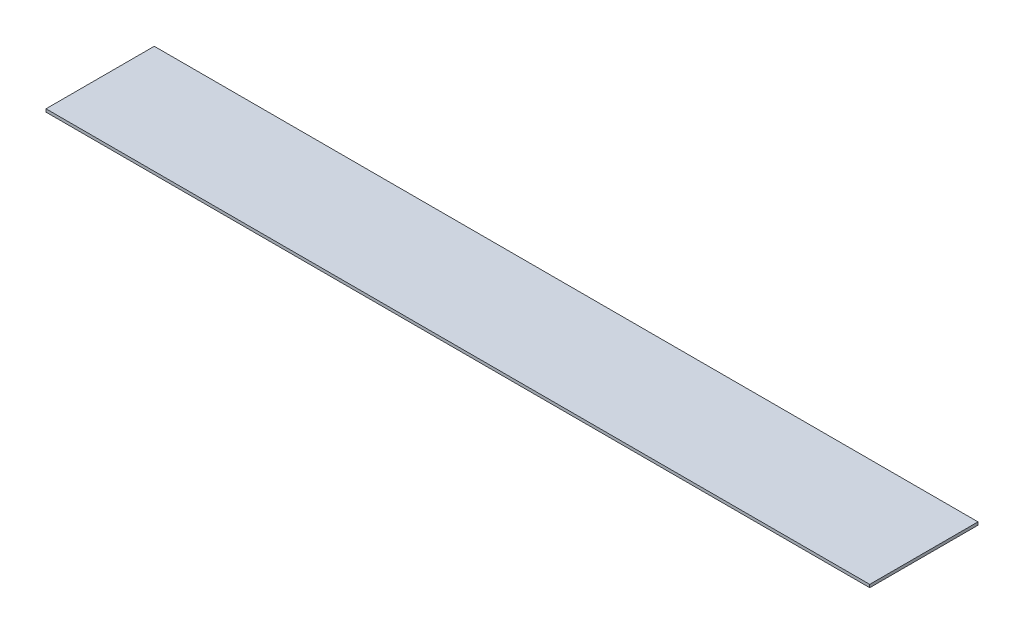
ISO-10303-21;
HEADER;
FILE_DESCRIPTION(('STEP AP214'),'2;1');
FILE_NAME('part.step','',(''),(''),'','','');
FILE_SCHEMA(('AUTOMOTIVE_DESIGN { 1 0 10303 214 1 1 1 1 }'));
ENDSEC;
DATA;
#1=APPLICATION_CONTEXT('core data for automotive mechanical design processes');
#2=APPLICATION_PROTOCOL_DEFINITION('international standard','automotive_design',2000,#1);
#3=PRODUCT_CONTEXT('',#1,'mechanical');
#4=PRODUCT('Part','Part','',(#3));
#5=PRODUCT_RELATED_PRODUCT_CATEGORY('part','',(#4));
#6=PRODUCT_DEFINITION_FORMATION('','',#4);
#7=PRODUCT_DEFINITION_CONTEXT('part definition',#1,'design');
#8=PRODUCT_DEFINITION('design','',#6,#7);
#9=PRODUCT_DEFINITION_SHAPE('','',#8);
#10=(LENGTH_UNIT() NAMED_UNIT(*) SI_UNIT(.MILLI.,.METRE.));
#11=(NAMED_UNIT(*) PLANE_ANGLE_UNIT() SI_UNIT($,.RADIAN.));
#12=(NAMED_UNIT(*) SI_UNIT($,.STERADIAN.) SOLID_ANGLE_UNIT());
#13=UNCERTAINTY_MEASURE_WITH_UNIT(LENGTH_MEASURE(1.E-05),#10,'distance_accuracy_value','');
#14=(GEOMETRIC_REPRESENTATION_CONTEXT(3) GLOBAL_UNCERTAINTY_ASSIGNED_CONTEXT((#13)) GLOBAL_UNIT_ASSIGNED_CONTEXT((#10,
#11,#12)) REPRESENTATION_CONTEXT('',''));
#15=CARTESIAN_POINT('',(0.,0.,0.));
#16=DIRECTION('',(0.,0.,1.));
#17=DIRECTION('',(1.,0.,0.));
#18=AXIS2_PLACEMENT_3D('',#15,#16,#17);
#19=CARTESIAN_POINT('',(893.7625,6.35,117.475));
#20=DIRECTION('',(-1.,0.,0.));
#21=DIRECTION('',(0.,0.,1.));
#22=AXIS2_PLACEMENT_3D('',#19,#20,#21);
#23=PLANE('',#22);
#24=DIRECTION('',(0.,0.,-1.));
#25=VECTOR('',#24,1.);
#26=CARTESIAN_POINT('',(893.7625,0.,117.475));
#27=LINE('',#26,#25);
#28=CARTESIAN_POINT('',(893.7625,0.,117.475));
#29=VERTEX_POINT('',#28);
#30=CARTESIAN_POINT('',(893.7625,0.,-117.475));
#31=VERTEX_POINT('',#30);
#32=EDGE_CURVE('E111',#29,#31,#27,.T.);
#33=ORIENTED_EDGE('',*,*,#32,.T.);
#34=DIRECTION('',(0.,-1.,0.));
#35=VECTOR('',#34,1.);
#36=CARTESIAN_POINT('',(893.7625,6.35,-117.475));
#37=LINE('',#36,#35);
#38=CARTESIAN_POINT('',(893.7625,6.35,-117.475));
#39=VERTEX_POINT('',#38);
#40=EDGE_CURVE('E11',#39,#31,#37,.T.);
#41=ORIENTED_EDGE('',*,*,#40,.F.);
#42=DIRECTION('',(0.,0.,-1.));
#43=VECTOR('',#42,1.);
#44=CARTESIAN_POINT('',(893.7625,6.35,117.475));
#45=LINE('',#44,#43);
#46=CARTESIAN_POINT('',(893.7625,6.35,117.475));
#47=VERTEX_POINT('',#46);
#48=EDGE_CURVE('E95',#47,#39,#45,.T.);
#49=ORIENTED_EDGE('',*,*,#48,.F.);
#50=DIRECTION('',(0.,-1.,0.));
#51=VECTOR('',#50,1.);
#52=CARTESIAN_POINT('',(893.7625,6.35,117.475));
#53=LINE('',#52,#51);
#54=EDGE_CURVE('E107',#47,#29,#53,.T.);
#55=ORIENTED_EDGE('',*,*,#54,.T.);
#56=EDGE_LOOP('',(#33,#41,#49,#55));
#57=FACE_BOUND('',#56,.T.);
#58=ADVANCED_FACE('F43',(#57),#23,.F.);
#59=CARTESIAN_POINT('',(-893.7625,6.35,-117.475));
#60=DIRECTION('',(0.,0.,1.));
#61=DIRECTION('',(1.,0.,0.));
#62=AXIS2_PLACEMENT_3D('',#59,#60,#61);
#63=PLANE('',#62);
#64=DIRECTION('',(-1.,0.,0.));
#65=VECTOR('',#64,1.);
#66=CARTESIAN_POINT('',(-893.7625,0.,-117.475));
#67=LINE('',#66,#65);
#68=CARTESIAN_POINT('',(-893.7625,0.,-117.475));
#69=VERTEX_POINT('',#68);
#70=EDGE_CURVE('E100',#31,#69,#67,.T.);
#71=ORIENTED_EDGE('',*,*,#70,.T.);
#72=DIRECTION('',(0.,-1.,0.));
#73=VECTOR('',#72,1.);
#74=CARTESIAN_POINT('',(-893.7625,6.35,-117.475));
#75=LINE('',#74,#73);
#76=CARTESIAN_POINT('',(-893.7625,6.35,-117.475));
#77=VERTEX_POINT('',#76);
#78=EDGE_CURVE('E52',#77,#69,#75,.T.);
#79=ORIENTED_EDGE('',*,*,#78,.F.);
#80=DIRECTION('',(-1.,0.,0.));
#81=VECTOR('',#80,1.);
#82=CARTESIAN_POINT('',(-893.7625,6.35,-117.475));
#83=LINE('',#82,#81);
#84=EDGE_CURVE('E90',#39,#77,#83,.T.);
#85=ORIENTED_EDGE('',*,*,#84,.F.);
#86=ORIENTED_EDGE('',*,*,#40,.T.);
#87=EDGE_LOOP('',(#71,#79,#85,#86));
#88=FACE_BOUND('',#87,.T.);
#89=ADVANCED_FACE('F99',(#88),#63,.F.);
#90=CARTESIAN_POINT('',(-893.7625,6.35,117.475));
#91=DIRECTION('',(1.,0.,0.));
#92=DIRECTION('',(0.,0.,-1.));
#93=AXIS2_PLACEMENT_3D('',#90,#91,#92);
#94=PLANE('',#93);
#95=DIRECTION('',(0.,0.,1.));
#96=VECTOR('',#95,1.);
#97=CARTESIAN_POINT('',(-893.7625,0.,117.475));
#98=LINE('',#97,#96);
#99=CARTESIAN_POINT('',(-893.7625,0.,117.475));
#100=VERTEX_POINT('',#99);
#101=EDGE_CURVE('E77',#69,#100,#98,.T.);
#102=ORIENTED_EDGE('',*,*,#101,.T.);
#103=DIRECTION('',(0.,-1.,0.));
#104=VECTOR('',#103,1.);
#105=CARTESIAN_POINT('',(-893.7625,6.35,117.475));
#106=LINE('',#105,#104);
#107=CARTESIAN_POINT('',(-893.7625,6.35,117.475));
#108=VERTEX_POINT('',#107);
#109=EDGE_CURVE('E102',#108,#100,#106,.T.);
#110=ORIENTED_EDGE('',*,*,#109,.F.);
#111=DIRECTION('',(0.,0.,1.));
#112=VECTOR('',#111,1.);
#113=CARTESIAN_POINT('',(-893.7625,6.35,117.475));
#114=LINE('',#113,#112);
#115=EDGE_CURVE('E93',#77,#108,#114,.T.);
#116=ORIENTED_EDGE('',*,*,#115,.F.);
#117=ORIENTED_EDGE('',*,*,#78,.T.);
#118=EDGE_LOOP('',(#102,#110,#116,#117));
#119=FACE_BOUND('',#118,.T.);
#120=ADVANCED_FACE('F103',(#119),#94,.F.);
#121=CARTESIAN_POINT('',(-893.7625,6.35,117.475));
#122=DIRECTION('',(0.,0.,-1.));
#123=DIRECTION('',(-1.,0.,0.));
#124=AXIS2_PLACEMENT_3D('',#121,#122,#123);
#125=PLANE('',#124);
#126=DIRECTION('',(1.,0.,0.));
#127=VECTOR('',#126,1.);
#128=CARTESIAN_POINT('',(-893.7625,0.,117.475));
#129=LINE('',#128,#127);
#130=EDGE_CURVE('E83',#100,#29,#129,.T.);
#131=ORIENTED_EDGE('',*,*,#130,.T.);
#132=ORIENTED_EDGE('',*,*,#54,.F.);
#133=DIRECTION('',(1.,0.,0.));
#134=VECTOR('',#133,1.);
#135=CARTESIAN_POINT('',(-893.7625,6.35,117.475));
#136=LINE('',#135,#134);
#137=EDGE_CURVE('E60',#108,#47,#136,.T.);
#138=ORIENTED_EDGE('',*,*,#137,.F.);
#139=ORIENTED_EDGE('',*,*,#109,.T.);
#140=EDGE_LOOP('',(#131,#132,#138,#139));
#141=FACE_BOUND('',#140,.T.);
#142=ADVANCED_FACE('F124',(#141),#125,.F.);
#143=CARTESIAN_POINT('',(0.,6.35,0.));
#144=DIRECTION('',(0.,-1.,0.));
#145=DIRECTION('',(0.,0.,-1.));
#146=AXIS2_PLACEMENT_3D('',#143,#144,#145);
#147=PLANE('',#146);
#148=ORIENTED_EDGE('',*,*,#48,.T.);
#149=ORIENTED_EDGE('',*,*,#84,.T.);
#150=ORIENTED_EDGE('',*,*,#115,.T.);
#151=ORIENTED_EDGE('',*,*,#137,.T.);
#152=EDGE_LOOP('',(#148,#149,#150,#151));
#153=FACE_BOUND('',#152,.T.);
#154=ADVANCED_FACE('F91',(#153),#147,.F.);
#155=CARTESIAN_POINT('',(0.,0.,0.));
#156=DIRECTION('',(0.,-1.,0.));
#157=DIRECTION('',(0.,0.,-1.));
#158=AXIS2_PLACEMENT_3D('',#155,#156,#157);
#159=PLANE('',#158);
#160=ORIENTED_EDGE('',*,*,#32,.F.);
#161=ORIENTED_EDGE('',*,*,#130,.F.);
#162=ORIENTED_EDGE('',*,*,#101,.F.);
#163=ORIENTED_EDGE('',*,*,#70,.F.);
#164=EDGE_LOOP('',(#160,#161,#162,#163));
#165=FACE_BOUND('',#164,.T.);
#166=ADVANCED_FACE('F127',(#165),#159,.T.);
#167=CLOSED_SHELL('',(#58,#89,#120,#142,#154,#166));
#168=MANIFOLD_SOLID_BREP('B2',#167);
#169=ADVANCED_BREP_SHAPE_REPRESENTATION('',(#18,#168),#14);
#170=SHAPE_DEFINITION_REPRESENTATION(#9,#169);
ENDSEC;
END-ISO-10303-21;
